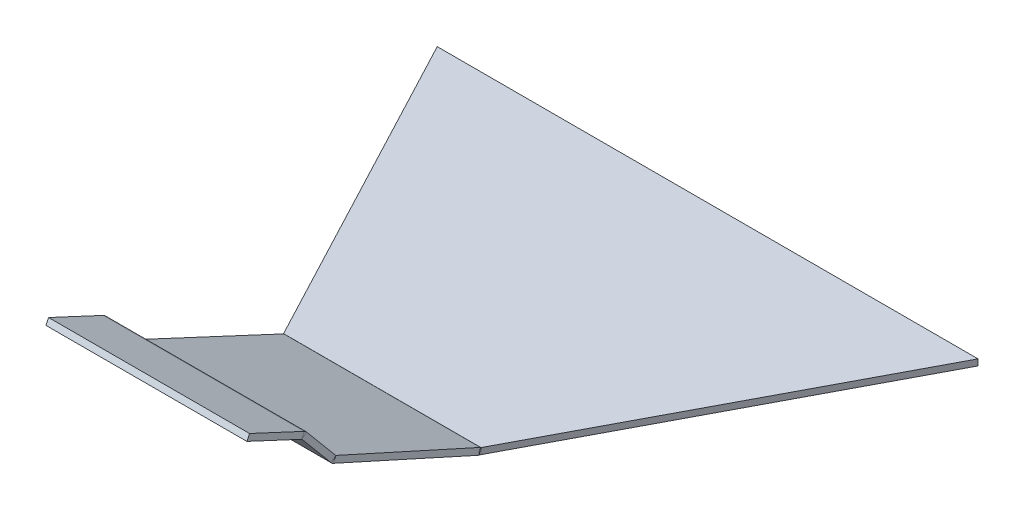
ISO-10303-21;
HEADER;
FILE_DESCRIPTION(('STEP AP214'),'2;1');
FILE_NAME('part.step','',(''),(''),'','','');
FILE_SCHEMA(('AUTOMOTIVE_DESIGN { 1 0 10303 214 1 1 1 1 }'));
ENDSEC;
DATA;
#1=APPLICATION_CONTEXT('core data for automotive mechanical design processes');
#2=APPLICATION_PROTOCOL_DEFINITION('international standard','automotive_design',2000,#1);
#3=PRODUCT_CONTEXT('',#1,'mechanical');
#4=PRODUCT('Part','Part','',(#3));
#5=PRODUCT_RELATED_PRODUCT_CATEGORY('part','',(#4));
#6=PRODUCT_DEFINITION_FORMATION('','',#4);
#7=PRODUCT_DEFINITION_CONTEXT('part definition',#1,'design');
#8=PRODUCT_DEFINITION('design','',#6,#7);
#9=PRODUCT_DEFINITION_SHAPE('','',#8);
#10=(LENGTH_UNIT() NAMED_UNIT(*) SI_UNIT(.MILLI.,.METRE.));
#11=(NAMED_UNIT(*) PLANE_ANGLE_UNIT() SI_UNIT($,.RADIAN.));
#12=(NAMED_UNIT(*) SI_UNIT($,.STERADIAN.) SOLID_ANGLE_UNIT());
#13=UNCERTAINTY_MEASURE_WITH_UNIT(LENGTH_MEASURE(1.E-05),#10,'distance_accuracy_value','');
#14=(GEOMETRIC_REPRESENTATION_CONTEXT(3) GLOBAL_UNCERTAINTY_ASSIGNED_CONTEXT((#13)) GLOBAL_UNIT_ASSIGNED_CONTEXT((#10,
#11,#12)) REPRESENTATION_CONTEXT('',''));
#15=CARTESIAN_POINT('',(0.,0.,0.));
#16=DIRECTION('',(0.,0.,1.));
#17=DIRECTION('',(1.,0.,0.));
#18=AXIS2_PLACEMENT_3D('',#15,#16,#17);
#19=CARTESIAN_POINT('',(-101.603058866823,67.5728649365524,165.985162331636));
#20=DIRECTION('',(0.99999996928593,-0.000104744671645585,-0.000224625673230387));
#21=DIRECTION('',(-0.000224625674462621,0.,-0.999999974771653));
#22=AXIS2_PLACEMENT_3D('',#19,#20,#21);
#23=PLANE('',#22);
#24=DIRECTION('',(-0.000104744671653627,0.642787615171689,-0.766044431355288));
#25=VECTOR('',#24,1.);
#26=CARTESIAN_POINT('',(-101.592414719057,103.872767817608,196.444396723192));
#27=LINE('',#26,#25);
#28=CARTESIAN_POINT('',(-101.592414719057,103.872767817608,196.444396723192));
#29=VERTEX_POINT('',#28);
#30=CARTESIAN_POINT('',(-101.593079847722,107.954469173948,191.580014584086));
#31=VERTEX_POINT('',#30);
#32=EDGE_CURVE('E281',#29,#31,#27,.T.);
#33=ORIENTED_EDGE('',*,*,#32,.T.);
#34=DIRECTION('',(0.000224625673230413,0.766044431354803,0.642787584458196));
#35=VECTOR('',#34,1.);
#36=CARTESIAN_POINT('',(-101.603723995488,71.6545662928963,161.120780192533));
#37=LINE('',#36,#35);
#38=CARTESIAN_POINT('',(-101.603687314051,71.7796615695422,161.225747590521));
#39=VERTEX_POINT('',#38);
#40=EDGE_CURVE('E301',#31,#39,#37,.F.);
#41=ORIENTED_EDGE('',*,*,#40,.T.);
#42=DIRECTION('',(-0.000104744671645529,0.642787615172266,-0.766044431354804));
#43=VECTOR('',#42,1.);
#44=CARTESIAN_POINT('',(-101.603022185386,67.6979602131986,166.090129729624));
#45=LINE('',#44,#43);
#46=CARTESIAN_POINT('',(-101.603022185386,67.6979602131983,166.090129729623));
#47=VERTEX_POINT('',#46);
#48=EDGE_CURVE('E290',#39,#47,#45,.F.);
#49=ORIENTED_EDGE('',*,*,#48,.T.);
#50=DIRECTION('',(-0.000224625673230413,-0.766044431354803,-0.642787584458196));
#51=VECTOR('',#50,1.);
#52=CARTESIAN_POINT('',(-101.641706121539,-64.2264696465449,55.3923919357524));
#53=LINE('',#52,#51);
#54=EDGE_CURVE('E296',#29,#47,#53,.T.);
#55=ORIENTED_EDGE('',*,*,#54,.F.);
#56=EDGE_LOOP('',(#33,#41,#49,#55));
#57=FACE_BOUND('',#56,.T.);
#58=ADVANCED_FACE('F99',(#57),#23,.F.);
#59=CARTESIAN_POINT('',(105.976664823351,115.486230414476,206.160867291729));
#60=DIRECTION('',(-0.99999996928593,0.000104744671645585,0.000224625673230387));
#61=DIRECTION('',(0.000224625674462621,0.,0.999999974771653));
#62=AXIS2_PLACEMENT_3D('',#59,#60,#61);
#63=PLANE('',#62);
#64=DIRECTION('',(-0.000104744671658042,0.642787615171689,-0.766044431355288));
#65=VECTOR('',#64,1.);
#66=CARTESIAN_POINT('',(105.973253055804,103.851026419225,196.397772143894));
#67=LINE('',#66,#65);
#68=CARTESIAN_POINT('',(105.973253055804,103.851026419225,196.397772143894));
#69=VERTEX_POINT('',#68);
#70=CARTESIAN_POINT('',(105.972587927139,107.932727775568,191.533390004792));
#71=VERTEX_POINT('',#70);
#72=EDGE_CURVE('E288',#69,#71,#67,.T.);
#73=ORIENTED_EDGE('',*,*,#72,.F.);
#74=DIRECTION('',(0.000224625673230413,0.766044431354803,0.642787584458196));
#75=VECTOR('',#74,1.);
#76=CARTESIAN_POINT('',(105.923961653322,-64.2482110449287,55.345767356457));
#77=LINE('',#76,#75);
#78=CARTESIAN_POINT('',(105.962645589475,67.6762188148148,166.043505150328));
#79=VERTEX_POINT('',#78);
#80=EDGE_CURVE('E292',#79,#69,#77,.T.);
#81=ORIENTED_EDGE('',*,*,#80,.F.);
#82=DIRECTION('',(-0.000104744671645529,0.642787615172266,-0.766044431354804));
#83=VECTOR('',#82,1.);
#84=CARTESIAN_POINT('',(105.96198046081,71.7579201711587,161.179123011225));
#85=LINE('',#84,#83);
#86=CARTESIAN_POINT('',(105.96198046081,71.7579201711593,161.179123011225));
#87=VERTEX_POINT('',#86);
#88=EDGE_CURVE('E305',#87,#79,#85,.F.);
#89=ORIENTED_EDGE('',*,*,#88,.F.);
#90=DIRECTION('',(-0.000224625673230413,-0.766044431354803,-0.642787584458196));
#91=VECTOR('',#90,1.);
#92=CARTESIAN_POINT('',(105.975999694686,119.56793177082,201.296485152626));
#93=LINE('',#92,#91);
#94=EDGE_CURVE('E298',#87,#71,#93,.F.);
#95=ORIENTED_EDGE('',*,*,#94,.T.);
#96=EDGE_LOOP('',(#73,#81,#89,#95));
#97=FACE_BOUND('',#96,.T.);
#98=ADVANCED_FACE('F711',(#97),#63,.F.);
#99=CARTESIAN_POINT('',(0.00570892901990814,-64.237116671985,55.3695593160133));
#100=DIRECTION('',(-0.000104744671645529,0.642787615172266,-0.766044431354803));
#101=DIRECTION('',(0.,0.766044435557111,0.642787618698421));
#102=AXIS2_PLACEMENT_3D('',#99,#100,#101);
#103=PLANE('',#102);
#104=DIRECTION('',(-0.99999996928593,0.000104744671644542,0.000224625673239862));
#105=VECTOR('',#104,1.);
#106=CARTESIAN_POINT('',(-101.592414719057,103.872767817608,196.444396723192));
#107=LINE('',#106,#105);
#108=EDGE_CURVE('E285',#29,#69,#107,.F.);
#109=ORIENTED_EDGE('',*,*,#108,.F.);
#110=ORIENTED_EDGE('',*,*,#54,.T.);
#111=DIRECTION('',(0.99999996928593,-0.000104744671645513,-0.000224625673230327));
#112=VECTOR('',#111,1.);
#113=CARTESIAN_POINT('',(-101.603022185386,67.6979602131986,166.090129729624));
#114=LINE('',#113,#112);
#115=EDGE_CURVE('E303',#79,#47,#114,.F.);
#116=ORIENTED_EDGE('',*,*,#115,.F.);
#117=ORIENTED_EDGE('',*,*,#80,.T.);
#118=EDGE_LOOP('',(#109,#110,#116,#117));
#119=FACE_BOUND('',#118,.T.);
#120=ADVANCED_FACE('F716',(#119),#103,.F.);
#121=CARTESIAN_POINT('',(0.00504380035495903,-60.1554153156411,50.5051771769103));
#122=DIRECTION('',(-0.000104744671645529,0.642787615172266,-0.766044431354803));
#123=DIRECTION('',(0.,0.766044435557111,0.642787618698421));
#124=AXIS2_PLACEMENT_3D('',#121,#122,#123);
#125=PLANE('',#124);
#126=ORIENTED_EDGE('',*,*,#40,.F.);
#127=DIRECTION('',(-0.99999996928593,0.000104744671644542,0.000224625673239862));
#128=VECTOR('',#127,1.);
#129=CARTESIAN_POINT('',(-101.593079847722,107.954469173948,191.580014584086));
#130=LINE('',#129,#128);
#131=EDGE_CURVE('E232',#31,#71,#130,.F.);
#132=ORIENTED_EDGE('',*,*,#131,.T.);
#133=ORIENTED_EDGE('',*,*,#94,.F.);
#134=DIRECTION('',(0.99999996928593,-0.000104744671645513,-0.000224625673230327));
#135=VECTOR('',#134,1.);
#136=CARTESIAN_POINT('',(-101.603687314051,71.7796615695425,161.225747590521));
#137=LINE('',#136,#135);
#138=EDGE_CURVE('E308',#39,#87,#137,.T.);
#139=ORIENTED_EDGE('',*,*,#138,.F.);
#140=EDGE_LOOP('',(#126,#132,#133,#139));
#141=FACE_BOUND('',#140,.T.);
#142=ADVANCED_FACE('F720',(#141),#125,.T.);
#143=CARTESIAN_POINT('',(0.,-3.7347721566697,-0.552177845198541));
#144=DIRECTION('',(0.,-0.90630778703665,0.4226182617407));
#145=DIRECTION('',(0.,-0.4226182617407,-0.90630778703665));
#146=AXIS2_PLACEMENT_3D('',#143,#144,#145);
#147=PLANE('',#146);
#148=DIRECTION('',(0.99999996928593,-0.000104744671641555,-0.000224625673231256));
#149=VECTOR('',#148,1.);
#150=CARTESIAN_POINT('',(105.961903305884,71.5638112125641,160.926155294687));
#151=LINE('',#150,#149);
#152=CARTESIAN_POINT('',(105.607656787093,71.5638483180005,160.926234867552));
#153=VERTEX_POINT('',#152);
#154=CARTESIAN_POINT('',(-101.6,71.5855522166389,160.972779028386));
#155=VERTEX_POINT('',#154);
#156=EDGE_CURVE('E312',#153,#155,#151,.F.);
#157=ORIENTED_EDGE('',*,*,#156,.F.);
#158=DIRECTION('',(-0.0235644997897284,-0.42250090851914,-0.906056122240869));
#159=VECTOR('',#158,1.);
#160=CARTESIAN_POINT('',(101.6,-0.29163975469091,6.83164341907567));
#161=LINE('',#160,#159);
#162=CARTESIAN_POINT('',(101.620115028655,0.0690136840687922,7.60506721440142));
#163=VERTEX_POINT('',#162);
#164=EDGE_CURVE('E104',#153,#163,#161,.T.);
#165=ORIENTED_EDGE('',*,*,#164,.T.);
#166=DIRECTION('',(-1.,0.,0.));
#167=VECTOR('',#166,1.);
#168=CARTESIAN_POINT('',(0.,0.0690136840688017,7.60506721440143));
#169=LINE('',#168,#167);
#170=CARTESIAN_POINT('',(-101.6,0.0690136840688044,7.60506721440143));
#171=VERTEX_POINT('',#170);
#172=EDGE_CURVE('E110',#163,#171,#169,.T.);
#173=ORIENTED_EDGE('',*,*,#172,.T.);
#174=DIRECTION('',(0.,0.4226182617407,0.90630778703665));
#175=VECTOR('',#174,1.);
#176=CARTESIAN_POINT('',(-101.6,-0.291639754690904,6.83164341907567));
#177=LINE('',#176,#175);
#178=EDGE_CURVE('E645',#171,#155,#177,.T.);
#179=ORIENTED_EDGE('',*,*,#178,.T.);
#180=EDGE_LOOP('',(#157,#165,#173,#179));
#181=FACE_BOUND('',#180,.T.);
#182=ADVANCED_FACE('F674',(#181),#147,.F.);
#183=CARTESIAN_POINT('',(101.6,-6.04669420237364,9.51526938112912));
#184=DIRECTION('',(0.999722318621356,-0.00995878793992415,-0.0213566896570544));
#185=DIRECTION('',(-0.0235644997897284,-0.42250090851914,-0.90605612224087));
#186=AXIS2_PLACEMENT_3D('',#183,#184,#185);
#187=PLANE('',#186);
#188=ORIENTED_EDGE('',*,*,#164,.F.);
#189=DIRECTION('',(0.,-0.906307787036695,0.422618261740603));
#190=VECTOR('',#189,1.);
#191=CARTESIAN_POINT('',(105.607656787093,71.5638483180005,160.926234867552));
#192=LINE('',#191,#190);
#193=CARTESIAN_POINT('',(105.607656787093,65.8087938703175,163.609860829605));
#194=VERTEX_POINT('',#193);
#195=EDGE_CURVE('E1016',#153,#194,#192,.T.);
#196=ORIENTED_EDGE('',*,*,#195,.T.);
#197=DIRECTION('',(-0.0235644997897284,-0.42250090851914,-0.906056122240869));
#198=VECTOR('',#197,1.);
#199=CARTESIAN_POINT('',(101.6,-6.04669420237364,9.51526938112912));
#200=LINE('',#199,#198);
#201=CARTESIAN_POINT('',(101.620115028655,-5.68604076361393,10.2886931764549));
#202=VERTEX_POINT('',#201);
#203=EDGE_CURVE('E648',#194,#202,#200,.T.);
#204=ORIENTED_EDGE('',*,*,#203,.T.);
#205=CARTESIAN_POINT('',(101.620115028656,0.0690136840688056,7.6050672144014));
#206=CARTESIAN_POINT('',(101.620115028656,-5.6860407636139,10.2886931764549));
#207=B_SPLINE_CURVE_WITH_KNOTS('',1,(#205,#206),.UNSPECIFIED.,.F.,.F.,(2,2),(0.,1.),.UNSPECIFIED.);
#208=EDGE_CURVE('E13',#163,#202,#207,.T.);
#209=ORIENTED_EDGE('',*,*,#208,.F.);
#210=EDGE_LOOP('',(#188,#196,#204,#209));
#211=FACE_BOUND('',#210,.T.);
#212=ADVANCED_FACE('F101',(#211),#187,.T.);
#213=CARTESIAN_POINT('',(0.,-9.48982660435243,2.13144811685491));
#214=DIRECTION('',(0.,-0.90630778703665,0.4226182617407));
#215=DIRECTION('',(0.,-0.4226182617407,-0.90630778703665));
#216=AXIS2_PLACEMENT_3D('',#213,#214,#215);
#217=PLANE('',#216);
#218=ORIENTED_EDGE('',*,*,#203,.F.);
#219=DIRECTION('',(0.99999996928593,-0.000104744671641555,-0.000224625673231256));
#220=VECTOR('',#219,1.);
#221=CARTESIAN_POINT('',(105.961903305885,65.8087567648811,163.60978125674));
#222=LINE('',#221,#220);
#223=CARTESIAN_POINT('',(-101.6,65.8304977689563,163.65640499044));
#224=VERTEX_POINT('',#223);
#225=EDGE_CURVE('E320',#194,#224,#222,.F.);
#226=ORIENTED_EDGE('',*,*,#225,.T.);
#227=DIRECTION('',(0.,0.4226182617407,0.90630778703665));
#228=VECTOR('',#227,1.);
#229=CARTESIAN_POINT('',(-101.6,-6.04669420237363,9.51526938112912));
#230=LINE('',#229,#228);
#231=CARTESIAN_POINT('',(-101.6,-5.68604076361388,10.2886931764549));
#232=VERTEX_POINT('',#231);
#233=EDGE_CURVE('E649',#232,#224,#230,.T.);
#234=ORIENTED_EDGE('',*,*,#233,.F.);
#235=DIRECTION('',(-1.,0.,0.));
#236=VECTOR('',#235,1.);
#237=CARTESIAN_POINT('',(0.,-5.68604076361392,10.2886931764549));
#238=LINE('',#237,#236);
#239=EDGE_CURVE('E644',#202,#232,#238,.T.);
#240=ORIENTED_EDGE('',*,*,#239,.F.);
#241=EDGE_LOOP('',(#218,#226,#234,#240));
#242=FACE_BOUND('',#241,.T.);
#243=ADVANCED_FACE('F627',(#242),#217,.T.);
#244=CARTESIAN_POINT('',(-101.6,-6.04669420237363,9.51526938112912));
#245=DIRECTION('',(-1.,0.,0.));
#246=DIRECTION('',(0.,0.4226182617407,0.90630778703665));
#247=AXIS2_PLACEMENT_3D('',#244,#245,#246);
#248=PLANE('',#247);
#249=DIRECTION('',(0.,-0.906307787036695,0.422618261740603));
#250=VECTOR('',#249,1.);
#251=CARTESIAN_POINT('',(-101.6,71.5855522166389,160.972779028386));
#252=LINE('',#251,#250);
#253=EDGE_CURVE('E575',#155,#224,#252,.T.);
#254=ORIENTED_EDGE('',*,*,#253,.F.);
#255=ORIENTED_EDGE('',*,*,#178,.F.);
#256=DIRECTION('',(0.,0.90630778703665,-0.4226182617407));
#257=VECTOR('',#256,1.);
#258=CARTESIAN_POINT('',(-101.6,-5.68604076361392,10.2886931764549));
#259=LINE('',#258,#257);
#260=EDGE_CURVE('E641',#232,#171,#259,.T.);
#261=ORIENTED_EDGE('',*,*,#260,.F.);
#262=ORIENTED_EDGE('',*,*,#233,.T.);
#263=EDGE_LOOP('',(#254,#255,#261,#262));
#264=FACE_BOUND('',#263,.T.);
#265=ADVANCED_FACE('F679',(#264),#248,.T.);
#266=CARTESIAN_POINT('',(-279.4,-6.35,-328.821933359543));
#267=DIRECTION('',(0.,0.,-1.));
#268=DIRECTION('',(-1.,0.,0.));
#269=AXIS2_PLACEMENT_3D('',#266,#267,#268);
#270=PLANE('',#269);
#271=DIRECTION('',(-1.,0.,0.));
#272=VECTOR('',#271,1.);
#273=CARTESIAN_POINT('',(-279.4,0.,-328.821933359543));
#274=LINE('',#273,#272);
#275=CARTESIAN_POINT('',(279.4,0.,-328.821933359543));
#276=VERTEX_POINT('',#275);
#277=CARTESIAN_POINT('',(-279.4,0.,-328.821933359543));
#278=VERTEX_POINT('',#277);
#279=EDGE_CURVE('E585',#276,#278,#274,.T.);
#280=ORIENTED_EDGE('',*,*,#279,.F.);
#281=DIRECTION('',(0.,1.,0.));
#282=VECTOR('',#281,1.);
#283=CARTESIAN_POINT('',(279.4,-6.35,-328.821933359543));
#284=LINE('',#283,#282);
#285=CARTESIAN_POINT('',(279.4,-6.35,-328.821933359543));
#286=VERTEX_POINT('',#285);
#287=EDGE_CURVE('E581',#286,#276,#284,.T.);
#288=ORIENTED_EDGE('',*,*,#287,.F.);
#289=DIRECTION('',(-1.,0.,0.));
#290=VECTOR('',#289,1.);
#291=CARTESIAN_POINT('',(-279.4,-6.35,-328.821933359543));
#292=LINE('',#291,#290);
#293=CARTESIAN_POINT('',(-279.4,-6.35,-328.821933359543));
#294=VERTEX_POINT('',#293);
#295=EDGE_CURVE('E591',#286,#294,#292,.T.);
#296=ORIENTED_EDGE('',*,*,#295,.T.);
#297=DIRECTION('',(0.,1.,0.));
#298=VECTOR('',#297,1.);
#299=CARTESIAN_POINT('',(-279.4,-6.35,-328.821933359543));
#300=LINE('',#299,#298);
#301=EDGE_CURVE('E594',#294,#278,#300,.T.);
#302=ORIENTED_EDGE('',*,*,#301,.T.);
#303=EDGE_LOOP('',(#280,#288,#296,#302));
#304=FACE_BOUND('',#303,.T.);
#305=ADVANCED_FACE('F454',(#304),#270,.T.);
#306=CARTESIAN_POINT('',(0.,-6.35,0.));
#307=DIRECTION('',(0.,-1.,0.));
#308=DIRECTION('',(0.,0.,-1.));
#309=AXIS2_PLACEMENT_3D('',#306,#307,#308);
#310=PLANE('',#309);
#311=DIRECTION('',(0.466666666666667,0.,-0.884433277428107));
#312=VECTOR('',#311,1.);
#313=CARTESIAN_POINT('',(279.4,-6.35,-328.821933359543));
#314=LINE('',#313,#312);
#315=CARTESIAN_POINT('',(102.05028089865,-6.35,7.29376660280316));
#316=VERTEX_POINT('',#315);
#317=EDGE_CURVE('E568',#316,#286,#314,.T.);
#318=ORIENTED_EDGE('',*,*,#317,.F.);
#319=DIRECTION('',(-1.,0.,0.));
#320=VECTOR('',#319,1.);
#321=CARTESIAN_POINT('',(0.,-6.35,7.29376660280319));
#322=LINE('',#321,#320);
#323=CARTESIAN_POINT('',(-102.050280898649,-6.35,7.29376660280318));
#324=VERTEX_POINT('',#323);
#325=EDGE_CURVE('E610',#316,#324,#322,.T.);
#326=ORIENTED_EDGE('',*,*,#325,.T.);
#327=DIRECTION('',(0.466666666666667,0.,0.884433277428107));
#328=VECTOR('',#327,1.);
#329=CARTESIAN_POINT('',(-279.4,-6.35,-328.821933359543));
#330=LINE('',#329,#328);
#331=EDGE_CURVE('E691',#294,#324,#330,.T.);
#332=ORIENTED_EDGE('',*,*,#331,.F.);
#333=ORIENTED_EDGE('',*,*,#295,.F.);
#334=EDGE_LOOP('',(#318,#326,#332,#333));
#335=FACE_BOUND('',#334,.T.);
#336=ADVANCED_FACE('F621',(#335),#310,.T.);
#337=CARTESIAN_POINT('',(-279.4,-6.35,-328.821933359543));
#338=DIRECTION('',(-0.884433277428107,0.,0.466666666666667));
#339=DIRECTION('',(0.466666666666667,0.,0.884433277428107));
#340=AXIS2_PLACEMENT_3D('',#337,#338,#339);
#341=PLANE('',#340);
#342=ORIENTED_EDGE('',*,*,#331,.T.);
#343=CARTESIAN_POINT('',(-102.050280898649,0.,7.29376660280318));
#344=CARTESIAN_POINT('',(-102.050280898649,-6.35,7.29376660280318));
#345=B_SPLINE_CURVE_WITH_KNOTS('',1,(#343,#344),.UNSPECIFIED.,.F.,.F.,(2,2),(0.,1.),.UNSPECIFIED.);
#346=CARTESIAN_POINT('',(-102.05028089865,0.,7.29376660280318));
#347=VERTEX_POINT('',#346);
#348=EDGE_CURVE('E586',#324,#347,#345,.F.);
#349=ORIENTED_EDGE('',*,*,#348,.T.);
#350=DIRECTION('',(0.466666666666667,0.,0.884433277428107));
#351=VECTOR('',#350,1.);
#352=CARTESIAN_POINT('',(-279.4,0.,-328.821933359543));
#353=LINE('',#352,#351);
#354=EDGE_CURVE('E569',#278,#347,#353,.T.);
#355=ORIENTED_EDGE('',*,*,#354,.F.);
#356=ORIENTED_EDGE('',*,*,#301,.F.);
#357=EDGE_LOOP('',(#342,#349,#355,#356));
#358=FACE_BOUND('',#357,.T.);
#359=ADVANCED_FACE('F612',(#358),#341,.T.);
#360=CARTESIAN_POINT('',(0.,0.,0.));
#361=DIRECTION('',(0.,-1.,0.));
#362=DIRECTION('',(0.,0.,-1.));
#363=AXIS2_PLACEMENT_3D('',#360,#361,#362);
#364=PLANE('',#363);
#365=DIRECTION('',(-1.,0.,0.));
#366=VECTOR('',#365,1.);
#367=CARTESIAN_POINT('',(0.,0.,7.29376660280319));
#368=LINE('',#367,#366);
#369=CARTESIAN_POINT('',(102.05028089865,0.,7.29376660280319));
#370=VERTEX_POINT('',#369);
#371=EDGE_CURVE('E572',#370,#347,#368,.T.);
#372=ORIENTED_EDGE('',*,*,#371,.F.);
#373=DIRECTION('',(0.466666666666667,0.,-0.884433277428107));
#374=VECTOR('',#373,1.);
#375=CARTESIAN_POINT('',(279.4,0.,-328.821933359543));
#376=LINE('',#375,#374);
#377=EDGE_CURVE('E578',#370,#276,#376,.T.);
#378=ORIENTED_EDGE('',*,*,#377,.T.);
#379=ORIENTED_EDGE('',*,*,#279,.T.);
#380=ORIENTED_EDGE('',*,*,#354,.T.);
#381=EDGE_LOOP('',(#372,#378,#379,#380));
#382=FACE_BOUND('',#381,.T.);
#383=ADVANCED_FACE('F588',(#382),#364,.F.);
#384=CARTESIAN_POINT('',(279.4,-6.35,-328.821933359543));
#385=DIRECTION('',(0.884433277428107,0.,0.466666666666667));
#386=DIRECTION('',(0.466666666666667,0.,-0.884433277428107));
#387=AXIS2_PLACEMENT_3D('',#384,#385,#386);
#388=PLANE('',#387);
#389=ORIENTED_EDGE('',*,*,#377,.F.);
#390=CARTESIAN_POINT('',(102.05028089865,-6.35,7.29376660280316));
#391=CARTESIAN_POINT('',(102.05028089865,0.,7.29376660280319));
#392=B_SPLINE_CURVE_WITH_KNOTS('',1,(#390,#391),.UNSPECIFIED.,.F.,.F.,(2,2),(0.,1.),.UNSPECIFIED.);
#393=EDGE_CURVE('E552',#370,#316,#392,.F.);
#394=ORIENTED_EDGE('',*,*,#393,.T.);
#395=ORIENTED_EDGE('',*,*,#317,.T.);
#396=ORIENTED_EDGE('',*,*,#287,.T.);
#397=EDGE_LOOP('',(#389,#394,#395,#396));
#398=FACE_BOUND('',#397,.T.);
#399=ADVANCED_FACE('F579',(#398),#388,.T.);
#400=CARTESIAN_POINT('',(102.05028089865,-6.35,7.29376660280316));
#401=CARTESIAN_POINT('',(101.900178255603,-6.35,7.80914963441766));
#402=CARTESIAN_POINT('',(101.750102643046,-6.29356858844899,8.32442117503446));
#403=CARTESIAN_POINT('',(101.6,-6.1820192840561,8.82758757093705));
#404=CARTESIAN_POINT('',(102.05028089865,0.,7.29376660280319));
#405=CARTESIAN_POINT('',(101.90018609808,0.,7.34733408316575));
#406=CARTESIAN_POINT('',(101.75009480057,0.00586623638615262,7.40089830524058));
#407=CARTESIAN_POINT('',(101.6,0.0174603611554601,7.45319602243001));
#408=B_SPLINE_SURFACE_WITH_KNOTS('',1,3,((#400,#401,#402,#403),(#404,#405,#406,#407)),
.UNSPECIFIED.,.F.,.F.,.F.,(2,2),(4,4),(0.,1.),(0.,1.),.UNSPECIFIED.);
#409=CARTESIAN_POINT('',(102.05028089865,0.,7.29376660280319));
#410=CARTESIAN_POINT('',(101.90018609808,0.,7.34733408316575));
#411=CARTESIAN_POINT('',(101.75009480057,0.00586623638615262,7.40089830524058));
#412=CARTESIAN_POINT('',(101.6,0.0174603611554601,7.45319602243001));
#413=B_SPLINE_CURVE_WITH_KNOTS('',3,(#409,#410,#411,#412),.UNSPECIFIED.,.F.,.F.,(4,4),(0.,1.),.UNSPECIFIED.);
#414=CARTESIAN_POINT('',(101.6,0.0174603611554593,7.45319602243001));
#415=VERTEX_POINT('',#414);
#416=EDGE_CURVE('E561',#370,#415,#413,.T.);
#417=CARTESIAN_POINT('',(101.6,0.0174603611554601,7.45319602243001));
#418=CARTESIAN_POINT('',(101.6,-6.1820192840561,8.82758757093705));
#419=B_SPLINE_CURVE_WITH_KNOTS('',1,(#417,#418),.UNSPECIFIED.,.F.,.F.,(2,2),(0.,1.),.UNSPECIFIED.);
#420=CARTESIAN_POINT('',(101.6,-6.1820192840561,8.82758757093705));
#421=VERTEX_POINT('',#420);
#422=EDGE_CURVE('E530',#415,#421,#419,.T.);
#423=CARTESIAN_POINT('',(101.6,-6.1820192840561,8.82758757093705));
#424=CARTESIAN_POINT('',(101.750102643046,-6.29356858844899,8.32442117503446));
#425=CARTESIAN_POINT('',(101.900178255603,-6.35,7.80914963441766));
#426=CARTESIAN_POINT('',(102.05028089865,-6.35,7.29376660280316));
#427=B_SPLINE_CURVE_WITH_KNOTS('',3,(#423,#424,#425,#426),.UNSPECIFIED.,.F.,.F.,(4,4),(0.,1.),.UNSPECIFIED.);
#428=EDGE_CURVE('E562',#316,#421,#427,.F.);
#429=ORIENTED_EDGE('',*,*,#393,.F.);
#430=ORIENTED_EDGE('',*,*,#416,.T.);
#431=ORIENTED_EDGE('',*,*,#422,.T.);
#432=ORIENTED_EDGE('',*,*,#428,.F.);
#433=EDGE_LOOP('',(#429,#430,#431,#432));
#434=FACE_BOUND('',#433,.T.);
#435=ADVANCED_FACE('F449',(#434),#408,.T.);
#436=CARTESIAN_POINT('',(101.6,-6.1820192840561,8.82758757093705));
#437=CARTESIAN_POINT('',(101.60670544385,-6.07046945073818,9.33075635266624));
#438=CARTESIAN_POINT('',(101.613409584806,-5.90385207734025,9.82159530680346));
#439=CARTESIAN_POINT('',(101.620115028656,-5.6860407636139,10.2886931764549));
#440=CARTESIAN_POINT('',(101.6,0.0174603611554601,7.45319602243001));
#441=CARTESIAN_POINT('',(101.606705437659,0.0290551359919663,7.50549667188309));
#442=CARTESIAN_POINT('',(101.613409590997,0.0463738193161372,7.5565158677599));
#443=CARTESIAN_POINT('',(101.620115028656,0.0690136840688056,7.6050672144014));
#444=B_SPLINE_SURFACE_WITH_KNOTS('',1,3,((#436,#437,#438,#439),(#440,#441,#442,#443)),
.UNSPECIFIED.,.F.,.F.,.F.,(2,2),(4,4),(0.,1.),(0.,1.),.UNSPECIFIED.);
#445=CARTESIAN_POINT('',(101.6,0.0174603611554601,7.45319602243001));
#446=CARTESIAN_POINT('',(101.606705437659,0.0290551359919663,7.50549667188309));
#447=CARTESIAN_POINT('',(101.613409590997,0.0463738193161372,7.5565158677599));
#448=CARTESIAN_POINT('',(101.620115028656,0.0690136840688056,7.6050672144014));
#449=B_SPLINE_CURVE_WITH_KNOTS('',3,(#445,#446,#447,#448),.UNSPECIFIED.,.F.,.F.,(4,4),(0.,1.),.UNSPECIFIED.);
#450=EDGE_CURVE('E428',#415,#163,#449,.T.);
#451=CARTESIAN_POINT('',(101.620115028656,-5.6860407636139,10.2886931764549));
#452=CARTESIAN_POINT('',(101.613409584806,-5.90385207734025,9.82159530680346));
#453=CARTESIAN_POINT('',(101.60670544385,-6.07046945073818,9.33075635266624));
#454=CARTESIAN_POINT('',(101.6,-6.1820192840561,8.82758757093705));
#455=B_SPLINE_CURVE_WITH_KNOTS('',3,(#451,#452,#453,#454),.UNSPECIFIED.,.F.,.F.,(4,4),(0.,1.),.UNSPECIFIED.);
#456=EDGE_CURVE('E408',#421,#202,#455,.F.);
#457=ORIENTED_EDGE('',*,*,#422,.F.);
#458=ORIENTED_EDGE('',*,*,#450,.T.);
#459=ORIENTED_EDGE('',*,*,#208,.T.);
#460=ORIENTED_EDGE('',*,*,#456,.F.);
#461=EDGE_LOOP('',(#457,#458,#459,#460));
#462=FACE_BOUND('',#461,.T.);
#463=ADVANCED_FACE('F493',(#462),#444,.T.);
#464=CARTESIAN_POINT('',(-101.6,0.7366,7.29376660280318));
#465=DIRECTION('',(-1.,0.,0.));
#466=DIRECTION('',(0.,0.,1.));
#467=AXIS2_PLACEMENT_3D('',#464,#465,#466);
#468=PLANE('',#467);
#469=ORIENTED_EDGE('',*,*,#260,.T.);
#470=CARTESIAN_POINT('',(-101.6,0.7366,7.29376660280318));
#471=DIRECTION('',(-1.,0.,0.));
#472=DIRECTION('',(0.,0.,1.));
#473=AXIS2_PLACEMENT_3D('',#470,#471,#472);
#474=CIRCLE('',#473,0.7366);
#475=CARTESIAN_POINT('',(-101.6,0.01746036115546,7.45319602243));
#476=VERTEX_POINT('',#475);
#477=EDGE_CURVE('E420',#171,#476,#474,.F.);
#478=ORIENTED_EDGE('',*,*,#477,.T.);
#479=CARTESIAN_POINT('',(-101.6,-6.18201928405609,8.82758757093706));
#480=CARTESIAN_POINT('',(-101.6,0.0174603611554618,7.45319602243));
#481=B_SPLINE_CURVE_WITH_KNOTS('',1,(#479,#480),.UNSPECIFIED.,.F.,.F.,(2,2),(0.,1.),.UNSPECIFIED.);
#482=CARTESIAN_POINT('',(-101.6,-6.18201928405609,8.82758757093706));
#483=VERTEX_POINT('',#482);
#484=EDGE_CURVE('E482',#476,#483,#481,.F.);
#485=ORIENTED_EDGE('',*,*,#484,.T.);
#486=CARTESIAN_POINT('',(-101.6,0.7366,7.29376660280318));
#487=DIRECTION('',(1.,0.,0.));
#488=DIRECTION('',(0.,0.,1.));
#489=AXIS2_PLACEMENT_3D('',#486,#487,#488);
#490=CIRCLE('',#489,7.0866);
#491=EDGE_CURVE('E406',#232,#483,#490,.T.);
#492=ORIENTED_EDGE('',*,*,#491,.F.);
#493=EDGE_LOOP('',(#469,#478,#485,#492));
#494=FACE_BOUND('',#493,.T.);
#495=ADVANCED_FACE('F448',(#494),#468,.T.);
#496=CARTESIAN_POINT('',(-101.6,-6.18201928405609,8.82758757093706));
#497=CARTESIAN_POINT('',(-101.750102643046,-6.29356858844898,8.32442117503451));
#498=CARTESIAN_POINT('',(-101.900178255603,-6.35,7.80914963441761));
#499=CARTESIAN_POINT('',(-102.050280898649,-6.35,7.29376660280318));
#500=CARTESIAN_POINT('',(-101.6,0.0174603611554618,7.45319602243));
#501=CARTESIAN_POINT('',(-101.750094800569,0.00586623638615378,7.40089830524058));
#502=CARTESIAN_POINT('',(-101.90018609808,0.,7.34733408316571));
#503=CARTESIAN_POINT('',(-102.050280898649,0.,7.29376660280318));
#504=B_SPLINE_SURFACE_WITH_KNOTS('',1,3,((#496,#497,#498,#499),(#500,#501,#502,#503)),
.UNSPECIFIED.,.F.,.F.,.F.,(2,2),(4,4),(0.,1.),(0.,1.),.UNSPECIFIED.);
#505=CARTESIAN_POINT('',(-101.6,0.0174603611554618,7.45319602243));
#506=CARTESIAN_POINT('',(-101.750094800569,0.00586623638615378,7.40089830524058));
#507=CARTESIAN_POINT('',(-101.90018609808,0.,7.34733408316571));
#508=CARTESIAN_POINT('',(-102.050280898649,0.,7.29376660280318));
#509=B_SPLINE_CURVE_WITH_KNOTS('',3,(#505,#506,#507,#508),.UNSPECIFIED.,.F.,.F.,(4,4),(0.,1.),.UNSPECIFIED.);
#510=EDGE_CURVE('E416',#476,#347,#509,.T.);
#511=CARTESIAN_POINT('',(-102.050280898649,-6.35,7.29376660280318));
#512=CARTESIAN_POINT('',(-101.900178255603,-6.35,7.80914963441761));
#513=CARTESIAN_POINT('',(-101.750102643046,-6.29356858844898,8.32442117503451));
#514=CARTESIAN_POINT('',(-101.6,-6.18201928405609,8.82758757093706));
#515=B_SPLINE_CURVE_WITH_KNOTS('',3,(#511,#512,#513,#514),.UNSPECIFIED.,.F.,.F.,(4,4),(0.,1.),.UNSPECIFIED.);
#516=EDGE_CURVE('E404',#483,#324,#515,.F.);
#517=ORIENTED_EDGE('',*,*,#510,.T.);
#518=ORIENTED_EDGE('',*,*,#348,.F.);
#519=ORIENTED_EDGE('',*,*,#516,.F.);
#520=ORIENTED_EDGE('',*,*,#484,.F.);
#521=EDGE_LOOP('',(#517,#518,#519,#520));
#522=FACE_BOUND('',#521,.T.);
#523=ADVANCED_FACE('F376',(#522),#504,.T.);
#524=CARTESIAN_POINT('',(204.206451531418,0.7366,7.2937666028032));
#525=DIRECTION('',(-1.,0.,0.));
#526=DIRECTION('',(0.,0.,1.));
#527=AXIS2_PLACEMENT_3D('',#524,#525,#526);
#528=CYLINDRICAL_SURFACE('',#527,7.0866);
#529=ORIENTED_EDGE('',*,*,#491,.T.);
#530=ORIENTED_EDGE('',*,*,#516,.T.);
#531=ORIENTED_EDGE('',*,*,#325,.F.);
#532=ORIENTED_EDGE('',*,*,#428,.T.);
#533=ORIENTED_EDGE('',*,*,#456,.T.);
#534=ORIENTED_EDGE('',*,*,#239,.T.);
#535=EDGE_LOOP('',(#529,#530,#531,#532,#533,#534));
#536=FACE_BOUND('',#535,.T.);
#537=ADVANCED_FACE('F365',(#536),#528,.T.);
#538=CARTESIAN_POINT('',(204.206451531418,0.7366,7.2937666028032));
#539=DIRECTION('',(-1.,0.,0.));
#540=DIRECTION('',(0.,0.,1.));
#541=AXIS2_PLACEMENT_3D('',#538,#539,#540);
#542=CYLINDRICAL_SURFACE('',#541,0.7366);
#543=ORIENTED_EDGE('',*,*,#477,.F.);
#544=ORIENTED_EDGE('',*,*,#172,.F.);
#545=ORIENTED_EDGE('',*,*,#450,.F.);
#546=ORIENTED_EDGE('',*,*,#416,.F.);
#547=ORIENTED_EDGE('',*,*,#371,.T.);
#548=ORIENTED_EDGE('',*,*,#510,.F.);
#549=EDGE_LOOP('',(#543,#544,#545,#546,#547,#548));
#550=FACE_BOUND('',#549,.T.);
#551=ADVANCED_FACE('F375',(#550),#542,.F.);
#552=CARTESIAN_POINT('',(-101.6,65.7729472244797,163.683241250061));
#553=CARTESIAN_POINT('',(-101.600997933297,66.2128223738044,164.626556551948));
#554=CARTESIAN_POINT('',(-101.601993431271,66.8598187479772,165.46973874196));
#555=CARTESIAN_POINT('',(-101.603015534099,67.657143199637,166.138773551016));
#556=CARTESIAN_POINT('',(-101.6,65.8304977689565,163.656404990441));
#557=CARTESIAN_POINT('',(-101.601000224303,66.2664663905515,164.591342716576));
#558=CARTESIAN_POINT('',(-101.601998006202,66.9077167946528,165.4270366127));
#559=CARTESIAN_POINT('',(-101.603022185386,67.6979602132004,166.090129729625));
#560=CARTESIAN_POINT('',(-101.6,71.585552216639,160.972779028387));
#561=CARTESIAN_POINT('',(-101.601229324851,71.630868065262,161.069959179367));
#562=CARTESIAN_POINT('',(-101.602455499266,71.6975214622132,161.156823686678));
#563=CARTESIAN_POINT('',(-101.603687314051,71.7796615695425,161.225747590521));
#564=B_SPLINE_SURFACE_WITH_KNOTS('',1,3,((#552,#553,#554,#555),(#556,#557,#558,#559),(#560,#561,
#562,#563)),.UNSPECIFIED.,.F.,.F.,.F.,(2,1,2),(4,4),(-0.01,0.,1.),(0.,1.),.UNSPECIFIED.);
#565=CARTESIAN_POINT('',(-101.6,71.585552216639,160.972779028387));
#566=CARTESIAN_POINT('',(-101.60015353376,71.5912114934742,160.984916308173));
#567=CARTESIAN_POINT('',(-101.600307067529,71.5972024351821,160.996898889539));
#568=CARTESIAN_POINT('',(-101.600614144933,71.6098283208548,161.020519825894));
#569=CARTESIAN_POINT('',(-101.600767688568,71.6164632648196,161.032158180883));
#570=CARTESIAN_POINT('',(-101.601074795553,71.6303578275176,161.05505583495));
#571=CARTESIAN_POINT('',(-101.601228358902,71.6376174462508,161.066315134028));
#572=CARTESIAN_POINT('',(-101.601535515097,71.6527396580851,161.088421250411));
#573=CARTESIAN_POINT('',(-101.601689107942,71.6606022511863,161.099268067715));
#574=CARTESIAN_POINT('',(-101.601996332825,71.6769070632063,161.120516939797));
#575=CARTESIAN_POINT('',(-101.602149964862,71.6853492821251,161.130918994575));
#576=CARTESIAN_POINT('',(-101.602457277706,71.7027882080166,161.151247433762));
#577=CARTESIAN_POINT('',(-101.602610958511,71.7117849149892,161.161173818172));
#578=CARTESIAN_POINT('',(-101.602918378336,71.7303061465602,161.180521304396));
#579=CARTESIAN_POINT('',(-101.603072117355,71.7398306711586,161.189942406211));
#580=CARTESIAN_POINT('',(-101.603379662825,71.7593788975562,161.208251643779));
#581=CARTESIAN_POINT('',(-101.603533469275,71.7694025993554,161.217139779532));
#582=CARTESIAN_POINT('',(-101.603687314051,71.7796615695425,161.225747590521));
#583=B_SPLINE_CURVE_WITH_KNOTS('',3,(#565,#566,#567,#568,#569,#570,#571,#572,#573,#574,#575,
#576,#577,#578,#579,#580,#581,#582),.UNSPECIFIED.,.F.,.F.,(4,2,2,2,2,2,2,2,4),(0.,
0.0401730741987591,0.0803461483975116,0.120519222596278,0.160692296795047,0.200865370993794,
0.241038445192559,0.281211519391312,0.32138459359009),.UNSPECIFIED.);
#584=EDGE_CURVE('E314',#155,#39,#583,.T.);
#585=CARTESIAN_POINT('',(-101.6,65.8304977689565,163.656404990441));
#586=CARTESIAN_POINT('',(-101.600124920706,65.8849437734272,163.773173688792));
#587=CARTESIAN_POINT('',(-101.6002498415,65.9425806227077,163.888454081644));
#588=CARTESIAN_POINT('',(-101.600499778009,66.0640500671193,164.115703172208));
#589=CARTESIAN_POINT('',(-101.600624793723,66.1278826622505,164.227671869921));
#590=CARTESIAN_POINT('',(-101.600875014817,66.2615576545947,164.447962486066));
#591=CARTESIAN_POINT('',(-101.601000220197,66.3314000518078,164.556284404499));
#592=CARTESIAN_POINT('',(-101.601250914725,66.4768858754985,164.768959882229));
#593=CARTESIAN_POINT('',(-101.601376403873,66.5525293019762,164.873313441527));
#594=CARTESIAN_POINT('',(-101.601627759228,66.7093925550395,165.077741637882));
#595=CARTESIAN_POINT('',(-101.601753625434,66.7906123816252,165.177816274939));
#596=CARTESIAN_POINT('',(-101.602005827028,66.9583865922791,165.373389272065));
#597=CARTESIAN_POINT('',(-101.602132162417,67.0449409763474,165.468887632133));
#598=CARTESIAN_POINT('',(-101.602385393247,67.2231277140564,165.655023185237));
#599=CARTESIAN_POINT('',(-101.602512288688,67.314760067697,165.745660378272));
#600=CARTESIAN_POINT('',(-101.602766728311,67.5028272039101,165.921807263267));
#601=CARTESIAN_POINT('',(-101.602894272492,67.5992619864824,166.007316955226));
#602=CARTESIAN_POINT('',(-101.603022185386,67.6979602132004,166.090129729625));
#603=B_SPLINE_CURVE_WITH_KNOTS('',3,(#585,#586,#587,#588,#589,#590,#591,#592,#593,#594,#595,
#596,#597,#598,#599,#600,#601,#602),.UNSPECIFIED.,.F.,.F.,(4,2,2,2,2,2,2,2,4),(0.,
0.386466451329206,0.772932902658436,1.15939935398764,1.54586580531685,1.93233225664607,
2.31879870797527,2.7052651593045,3.0917316106337),.UNSPECIFIED.);
#604=EDGE_CURVE('E125',#224,#47,#603,.T.);
#605=ORIENTED_EDGE('',*,*,#48,.F.);
#606=ORIENTED_EDGE('',*,*,#584,.F.);
#607=ORIENTED_EDGE('',*,*,#253,.T.);
#608=ORIENTED_EDGE('',*,*,#604,.T.);
#609=EDGE_LOOP('',(#605,#606,#607,#608));
#610=FACE_BOUND('',#609,.T.);
#611=ADVANCED_FACE('F337',(#610),#564,.F.);
#612=CARTESIAN_POINT('',(105.962652240761,67.63540180125,166.092148971717));
#613=CARTESIAN_POINT('',(105.844235406524,66.8380964536293,165.423146524271));
#614=CARTESIAN_POINT('',(105.726097790662,66.1911023270412,164.579977761349));
#615=CARTESIAN_POINT('',(105.607656787093,65.7512433258407,163.636697089226));
#616=CARTESIAN_POINT('',(105.962645589475,67.6762188148135,166.043505150326));
#617=CARTESIAN_POINT('',(105.844231314678,66.88599477434,165.380444624887));
#618=CARTESIAN_POINT('',(105.726095016563,66.2447461926289,164.544763601814));
#619=CARTESIAN_POINT('',(105.607656787093,65.8087938703175,163.609860829605));
#620=CARTESIAN_POINT('',(105.96198046081,71.7579201711591,161.179123011225));
#621=CARTESIAN_POINT('',(105.843822130121,71.6758268454121,161.110254686538));
#622=CARTESIAN_POINT('',(105.725817606676,71.6091327513954,161.023347648359));
#623=CARTESIAN_POINT('',(105.607656787093,71.5638483180005,160.926234867552));
#624=B_SPLINE_SURFACE_WITH_KNOTS('',1,3,((#612,#613,#614,#615),(#616,#617,#618,#619),(#620,#621,
#622,#623)),.UNSPECIFIED.,.F.,.F.,.F.,(2,1,2),(4,4),(-0.01,0.,1.),(0.,1.),.UNSPECIFIED.);
#625=CARTESIAN_POINT('',(105.96198046081,71.7579201711591,161.179123011225));
#626=CARTESIAN_POINT('',(105.916402112886,71.7262286351545,161.152584757874));
#627=CARTESIAN_POINT('',(105.870836985461,71.6968341944801,161.12333790323));
#628=CARTESIAN_POINT('',(105.789152806033,71.6488770316922,161.066878365122));
#629=CARTESIAN_POINT('',(105.753031868134,71.6293318130091,161.040498909904));
#630=CARTESIAN_POINT('',(105.680494571191,71.5937720160155,160.985157765338));
#631=CARTESIAN_POINT('',(105.644078198018,71.5777874358201,160.956176824835));
#632=CARTESIAN_POINT('',(105.607656787093,71.5638483180005,160.926234867552));
#633=B_SPLINE_CURVE_WITH_KNOTS('',3,(#625,#626,#627,#628,#629,#630,#631,#632),.UNSPECIFIED.,.F.,
.F.,(4,2,2,4),(0.,0.184444663869678,0.330689090212064,0.478122564697774),.UNSPECIFIED.);
#634=EDGE_CURVE('E295',#87,#153,#633,.T.);
#635=CARTESIAN_POINT('',(105.962645589475,67.6762188148135,166.043505150326));
#636=CARTESIAN_POINT('',(105.947502411988,67.5751619538727,165.958715075011));
#637=CARTESIAN_POINT('',(105.932358667526,67.4764795535461,165.871099513233));
#638=CARTESIAN_POINT('',(105.902073552454,67.2841755260216,165.6905173726));
#639=CARTESIAN_POINT('',(105.886932181969,67.1905528991118,165.597551858341));
#640=CARTESIAN_POINT('',(105.856649153698,67.008638981211,165.406534890406));
#641=CARTESIAN_POINT('',(105.841507495911,66.9203477474557,165.30848338215));
#642=CARTESIAN_POINT('',(105.811223931926,66.7493690439117,165.107605383907));
#643=CARTESIAN_POINT('',(105.796082026158,66.6666825681286,165.004778052348));
#644=CARTESIAN_POINT('',(105.752084039838,66.4349623817336,164.699515983296));
#645=CARTESIAN_POINT('',(105.723216213222,66.2935944399035,164.491141953833));
#646=CARTESIAN_POINT('',(105.679907229159,66.0987177056469,164.168178587988));
#647=CARTESIAN_POINT('',(105.665456448583,66.0365722756183,164.058685295461));
#648=CARTESIAN_POINT('',(105.636557142394,65.9182086176007,163.836563254806));
#649=CARTESIAN_POINT('',(105.622108616794,65.8619894326038,163.723935016654));
#650=CARTESIAN_POINT('',(105.607656787093,65.8087938703176,163.609860829605));
#651=B_SPLINE_CURVE_WITH_KNOTS('',3,(#635,#636,#637,#638,#639,#640,#641,#642,#643,#644,#645,
#646,#647,#648,#649,#650),.UNSPECIFIED.,.F.,.F.,(4,2,2,2,2,2,2,4),(0.,0.398290757663999,
0.796502531020791,1.19471857865716,1.59300506624235,2.35168213846522,2.73171780151478,
3.11169199966406),.UNSPECIFIED.);
#652=EDGE_CURVE('E319',#79,#194,#651,.T.);
#653=ORIENTED_EDGE('',*,*,#634,.F.);
#654=ORIENTED_EDGE('',*,*,#88,.T.);
#655=ORIENTED_EDGE('',*,*,#652,.T.);
#656=ORIENTED_EDGE('',*,*,#195,.F.);
#657=EDGE_LOOP('',(#653,#654,#655,#656));
#658=FACE_BOUND('',#657,.T.);
#659=ADVANCED_FACE('F359',(#658),#624,.F.);
#660=CARTESIAN_POINT('',(105.961903305884,72.2313975284951,160.614854683089));
#661=DIRECTION('',(0.99999996928593,-0.000104744671641555,-0.000224625673231256));
#662=DIRECTION('',(0.000104744671648785,-0.642787615172266,0.766044431354803));
#663=AXIS2_PLACEMENT_3D('',#660,#661,#662);
#664=CYLINDRICAL_SURFACE('',#663,7.08659999999972);
#665=ORIENTED_EDGE('',*,*,#225,.F.);
#666=ORIENTED_EDGE('',*,*,#652,.F.);
#667=ORIENTED_EDGE('',*,*,#115,.T.);
#668=ORIENTED_EDGE('',*,*,#604,.F.);
#669=EDGE_LOOP('',(#665,#666,#667,#668));
#670=FACE_BOUND('',#669,.T.);
#671=ADVANCED_FACE('F333',(#670),#664,.T.);
#672=CARTESIAN_POINT('',(105.961903305884,72.2313975284951,160.614854683089));
#673=DIRECTION('',(0.99999996928593,-0.000104744671641555,-0.000224625673231256));
#674=DIRECTION('',(0.000104744671648785,-0.642787615172266,0.766044431354803));
#675=AXIS2_PLACEMENT_3D('',#672,#673,#674);
#676=CYLINDRICAL_SURFACE('',#675,0.736599999999719);
#677=ORIENTED_EDGE('',*,*,#156,.T.);
#678=ORIENTED_EDGE('',*,*,#584,.T.);
#679=ORIENTED_EDGE('',*,*,#138,.T.);
#680=ORIENTED_EDGE('',*,*,#634,.T.);
#681=EDGE_LOOP('',(#677,#678,#679,#680));
#682=FACE_BOUND('',#681,.T.);
#683=ADVANCED_FACE('F322',(#682),#676,.F.);
#684=CARTESIAN_POINT('',(105.973330210729,103.377549061889,196.96204047203));
#685=DIRECTION('',(0.99999996928593,-0.000104744671644542,-0.000224625673239862));
#686=DIRECTION('',(-0.000224625674472097,0.,-0.999999974771653));
#687=AXIS2_PLACEMENT_3D('',#684,#685,#686);
#688=PLANE('',#687);
#689=DIRECTION('',(0.,0.90630778703665,-0.422618261740701));
#690=VECTOR('',#689,1.);
#691=CARTESIAN_POINT('',(105.973330210729,109.800189825503,193.96711389838));
#692=LINE('',#691,#690);
#693=CARTESIAN_POINT('',(105.973330210729,104.04513537782,196.650739860432));
#694=VERTEX_POINT('',#693);
#695=CARTESIAN_POINT('',(105.973330210729,109.800189825503,193.967113898379));
#696=VERTEX_POINT('',#695);
#697=EDGE_CURVE('E277',#694,#696,#692,.T.);
#698=ORIENTED_EDGE('',*,*,#697,.F.);
#699=CARTESIAN_POINT('',(105.973330210729,103.377549061889,196.96204047203));
#700=DIRECTION('',(-0.99999996928593,0.000104744671644542,0.000224625673239862));
#701=DIRECTION('',(0.000224625674472097,0.,0.999999974771653));
#702=AXIS2_PLACEMENT_3D('',#699,#700,#701);
#703=CIRCLE('',#702,0.736599999999526);
#704=EDGE_CURVE('E235',#69,#694,#703,.F.);
#705=ORIENTED_EDGE('',*,*,#704,.F.);
#706=ORIENTED_EDGE('',*,*,#72,.T.);
#707=CARTESIAN_POINT('',(105.973330210729,103.377549061889,196.96204047203));
#708=DIRECTION('',(-0.99999996928593,0.000104744671644542,0.000224625673239862));
#709=DIRECTION('',(0.000224625674472097,0.,0.999999974771653));
#710=AXIS2_PLACEMENT_3D('',#707,#708,#709);
#711=CIRCLE('',#710,7.08659999999953);
#712=EDGE_CURVE('E117',#71,#696,#711,.F.);
#713=ORIENTED_EDGE('',*,*,#712,.T.);
#714=EDGE_LOOP('',(#698,#705,#706,#713));
#715=FACE_BOUND('',#714,.T.);
#716=ADVANCED_FACE('F332',(#715),#688,.T.);
#717=CARTESIAN_POINT('',(-101.592337564132,103.399290460273,197.008665051328));
#718=DIRECTION('',(0.99999996928593,-0.000104744671644542,-0.000224625673239862));
#719=DIRECTION('',(-0.000224625674472097,0.,-0.999999974771653));
#720=AXIS2_PLACEMENT_3D('',#717,#718,#719);
#721=PLANE('',#720);
#722=CARTESIAN_POINT('',(-101.592337564132,103.399290460273,197.008665051328));
#723=DIRECTION('',(-0.99999996928593,0.000104744671644542,0.000224625673239862));
#724=DIRECTION('',(0.000224625674472097,0.,0.999999974771653));
#725=AXIS2_PLACEMENT_3D('',#722,#723,#724);
#726=CIRCLE('',#725,0.736599999999526);
#727=CARTESIAN_POINT('',(-101.592337564132,104.066876776204,196.69736443973));
#728=VERTEX_POINT('',#727);
#729=EDGE_CURVE('E242',#728,#29,#726,.T.);
#730=ORIENTED_EDGE('',*,*,#729,.F.);
#731=DIRECTION('',(0.,0.906307787036649,-0.422618261740701));
#732=VECTOR('',#731,1.);
#733=CARTESIAN_POINT('',(-101.592337564132,104.066876776204,196.697364439729));
#734=LINE('',#733,#732);
#735=CARTESIAN_POINT('',(-101.592337564132,109.821931223887,194.013738477675));
#736=VERTEX_POINT('',#735);
#737=EDGE_CURVE('E239',#728,#736,#734,.T.);
#738=ORIENTED_EDGE('',*,*,#737,.T.);
#739=CARTESIAN_POINT('',(-101.592337564132,103.399290460273,197.008665051328));
#740=DIRECTION('',(-0.99999996928593,0.000104744671644542,0.000224625673239862));
#741=DIRECTION('',(0.000224625674472097,0.,0.999999974771653));
#742=AXIS2_PLACEMENT_3D('',#739,#740,#741);
#743=CIRCLE('',#742,7.08659999999953);
#744=EDGE_CURVE('E226',#736,#31,#743,.T.);
#745=ORIENTED_EDGE('',*,*,#744,.T.);
#746=ORIENTED_EDGE('',*,*,#32,.F.);
#747=EDGE_LOOP('',(#730,#738,#745,#746));
#748=FACE_BOUND('',#747,.T.);
#749=ADVANCED_FACE('F240',(#748),#721,.F.);
#750=CARTESIAN_POINT('',(-101.592337564132,103.399290460273,197.008665051328));
#751=DIRECTION('',(-0.99999996928593,0.000104744671644542,0.000224625673239862));
#752=DIRECTION('',(0.,0.906307787036649,-0.4226182617407));
#753=AXIS2_PLACEMENT_3D('',#750,#751,#752);
#754=CYLINDRICAL_SURFACE('',#753,7.08659999999953);
#755=ORIENTED_EDGE('',*,*,#131,.F.);
#756=ORIENTED_EDGE('',*,*,#744,.F.);
#757=DIRECTION('',(-0.99999996928593,0.000104744671645758,0.00022462567323079));
#758=VECTOR('',#757,1.);
#759=CARTESIAN_POINT('',(0.0550774864270131,109.811284198447,193.990905857936));
#760=LINE('',#759,#758);
#761=EDGE_CURVE('E230',#696,#736,#760,.T.);
#762=ORIENTED_EDGE('',*,*,#761,.F.);
#763=ORIENTED_EDGE('',*,*,#712,.F.);
#764=EDGE_LOOP('',(#755,#756,#762,#763));
#765=FACE_BOUND('',#764,.T.);
#766=ADVANCED_FACE('F228',(#765),#754,.T.);
#767=CARTESIAN_POINT('',(-101.592337564132,103.399290460273,197.008665051328));
#768=DIRECTION('',(-0.99999996928593,0.000104744671644542,0.000224625673239862));
#769=DIRECTION('',(0.,0.906307787036649,-0.4226182617407));
#770=AXIS2_PLACEMENT_3D('',#767,#768,#769);
#771=CYLINDRICAL_SURFACE('',#770,0.736599999999526);
#772=ORIENTED_EDGE('',*,*,#108,.T.);
#773=ORIENTED_EDGE('',*,*,#704,.T.);
#774=DIRECTION('',(0.99999996928593,-0.000104744671645758,-0.00022462567323079));
#775=VECTOR('',#774,1.);
#776=CARTESIAN_POINT('',(105.973330210729,104.04513537782,196.650739860433));
#777=LINE('',#776,#775);
#778=EDGE_CURVE('E247',#694,#728,#777,.F.);
#779=ORIENTED_EDGE('',*,*,#778,.T.);
#780=ORIENTED_EDGE('',*,*,#729,.T.);
#781=EDGE_LOOP('',(#772,#773,#779,#780));
#782=FACE_BOUND('',#781,.T.);
#783=ADVANCED_FACE('F732',(#782),#771,.F.);
#784=CARTESIAN_POINT('',(-101.59237803762,109.752917541938,193.865738159125));
#785=DIRECTION('',(-0.99999996928593,0.000104744671645833,0.000224625673230952));
#786=DIRECTION('',(0.000224625674463186,0.,0.999999974771653));
#787=AXIS2_PLACEMENT_3D('',#784,#785,#786);
#788=PLANE('',#787);
#789=DIRECTION('',(-0.000247847007875124,-0.422618248760373,-0.906307759200249));
#790=VECTOR('',#789,1.);
#791=CARTESIAN_POINT('',(-101.59237803762,109.752917541938,193.865738159125));
#792=LINE('',#791,#790);
#793=CARTESIAN_POINT('',(-101.576862755718,136.208920874548,250.600820394931));
#794=VERTEX_POINT('',#793);
#795=EDGE_CURVE('E254',#794,#736,#792,.T.);
#796=ORIENTED_EDGE('',*,*,#795,.T.);
#797=ORIENTED_EDGE('',*,*,#737,.F.);
#798=DIRECTION('',(0.000247847007875124,0.422618248760373,0.906307759200249));
#799=VECTOR('',#798,1.);
#800=CARTESIAN_POINT('',(-101.650790136669,4.39601912527905,-17.047479565803));
#801=LINE('',#800,#799);
#802=CARTESIAN_POINT('',(-101.576862755718,130.453866426865,253.284446356985));
#803=VERTEX_POINT('',#802);
#804=EDGE_CURVE('E270',#803,#728,#801,.F.);
#805=ORIENTED_EDGE('',*,*,#804,.F.);
#806=DIRECTION('',(0.,-0.90630778703665,0.4226182617407));
#807=VECTOR('',#806,1.);
#808=CARTESIAN_POINT('',(-101.576862755718,136.208920874548,250.600820394931));
#809=LINE('',#808,#807);
#810=EDGE_CURVE('E259',#794,#803,#809,.T.);
#811=ORIENTED_EDGE('',*,*,#810,.F.);
#812=EDGE_LOOP('',(#796,#797,#805,#811));
#813=FACE_BOUND('',#812,.T.);
#814=ADVANCED_FACE('F258',(#813),#788,.T.);
#815=CARTESIAN_POINT('',(105.988805019143,136.187179476164,250.554195815636));
#816=DIRECTION('',(0.99999996928593,-0.000104744671645833,-0.000224625673230952));
#817=DIRECTION('',(-0.000224625674463186,0.,-0.999999974771653));
#818=AXIS2_PLACEMENT_3D('',#815,#816,#817);
#819=PLANE('',#818);
#820=DIRECTION('',(-0.000247847007875124,-0.422618248760373,-0.906307759200249));
#821=VECTOR('',#820,1.);
#822=CARTESIAN_POINT('',(105.914877638192,4.37427772689526,-17.0941041450986));
#823=LINE('',#822,#821);
#824=CARTESIAN_POINT('',(105.988805019143,130.432125028481,253.237821777689));
#825=VERTEX_POINT('',#824);
#826=EDGE_CURVE('E256',#694,#825,#823,.F.);
#827=ORIENTED_EDGE('',*,*,#826,.F.);
#828=ORIENTED_EDGE('',*,*,#697,.T.);
#829=DIRECTION('',(0.000247847007875124,0.422618248760373,0.906307759200249));
#830=VECTOR('',#829,1.);
#831=CARTESIAN_POINT('',(105.988805019143,136.187179476164,250.554195815636));
#832=LINE('',#831,#830);
#833=CARTESIAN_POINT('',(105.988805019143,136.187179476164,250.554195815636));
#834=VERTEX_POINT('',#833);
#835=EDGE_CURVE('E255',#696,#834,#832,.T.);
#836=ORIENTED_EDGE('',*,*,#835,.T.);
#837=DIRECTION('',(0.,-0.906307787036649,0.4226182617407));
#838=VECTOR('',#837,1.);
#839=CARTESIAN_POINT('',(105.988805019143,136.187179476164,250.554195815636));
#840=LINE('',#839,#838);
#841=EDGE_CURVE('E261',#834,#825,#840,.T.);
#842=ORIENTED_EDGE('',*,*,#841,.T.);
#843=EDGE_LOOP('',(#827,#828,#836,#842));
#844=FACE_BOUND('',#843,.T.);
#845=ADVANCED_FACE('F738',(#844),#819,.T.);
#846=CARTESIAN_POINT('',(-0.00337508610995315,10.1404265475216,-19.7539381475956));
#847=DIRECTION('',(0.,0.90630778703665,-0.4226182617407));
#848=DIRECTION('',(0.,0.4226182617407,0.906307787036649));
#849=AXIS2_PLACEMENT_3D('',#846,#847,#848);
#850=PLANE('',#849);
#851=ORIENTED_EDGE('',*,*,#835,.F.);
#852=ORIENTED_EDGE('',*,*,#761,.T.);
#853=ORIENTED_EDGE('',*,*,#795,.F.);
#854=DIRECTION('',(-0.99999996928593,0.000104744671645631,0.000224625673230519));
#855=VECTOR('',#854,1.);
#856=CARTESIAN_POINT('',(-101.576862755718,136.208920874548,250.600820394931));
#857=LINE('',#856,#855);
#858=EDGE_CURVE('E262',#834,#794,#857,.T.);
#859=ORIENTED_EDGE('',*,*,#858,.F.);
#860=EDGE_LOOP('',(#851,#852,#853,#859));
#861=FACE_BOUND('',#860,.T.);
#862=ADVANCED_FACE('F252',(#861),#850,.T.);
#863=CARTESIAN_POINT('',(-0.00337508610995325,4.38537209983892,-17.0703121855422));
#864=DIRECTION('',(0.,0.90630778703665,-0.4226182617407));
#865=DIRECTION('',(0.,0.4226182617407,0.906307787036649));
#866=AXIS2_PLACEMENT_3D('',#863,#864,#865);
#867=PLANE('',#866);
#868=ORIENTED_EDGE('',*,*,#778,.F.);
#869=ORIENTED_EDGE('',*,*,#826,.T.);
#870=DIRECTION('',(0.99999996928593,-0.000104744671645631,-0.000224625673230519));
#871=VECTOR('',#870,1.);
#872=CARTESIAN_POINT('',(0.0705522948407262,130.443219401425,253.261613737245));
#873=LINE('',#872,#871);
#874=EDGE_CURVE('E272',#825,#803,#873,.F.);
#875=ORIENTED_EDGE('',*,*,#874,.T.);
#876=ORIENTED_EDGE('',*,*,#804,.T.);
#877=EDGE_LOOP('',(#868,#869,#875,#876));
#878=FACE_BOUND('',#877,.T.);
#879=ADVANCED_FACE('F745',(#878),#867,.F.);
#880=CARTESIAN_POINT('',(-101.576862755718,136.208920874548,250.600820394931));
#881=DIRECTION('',(0.000247847007874646,0.422618248760373,0.906307759200249));
#882=DIRECTION('',(0.,-0.90630778703665,0.4226182617407));
#883=AXIS2_PLACEMENT_3D('',#880,#881,#882);
#884=PLANE('',#883);
#885=ORIENTED_EDGE('',*,*,#874,.F.);
#886=ORIENTED_EDGE('',*,*,#841,.F.);
#887=ORIENTED_EDGE('',*,*,#858,.T.);
#888=ORIENTED_EDGE('',*,*,#810,.T.);
#889=EDGE_LOOP('',(#885,#886,#887,#888));
#890=FACE_BOUND('',#889,.T.);
#891=ADVANCED_FACE('F742',(#890),#884,.T.);
#892=CLOSED_SHELL('',(#58,#98,#120,#142,#182,#212,#243,#265,#305,#336,#359,#383,#399,#435,#463,
#495,#523,#537,#551,#611,#659,#671,#683,#716,#749,#766,#783,#814,#845,#862,#879,#891));
#893=MANIFOLD_SOLID_BREP('B2',#892);
#894=ADVANCED_BREP_SHAPE_REPRESENTATION('',(#18,#893),#14);
#895=SHAPE_DEFINITION_REPRESENTATION(#9,#894);
ENDSEC;
END-ISO-10303-21;
